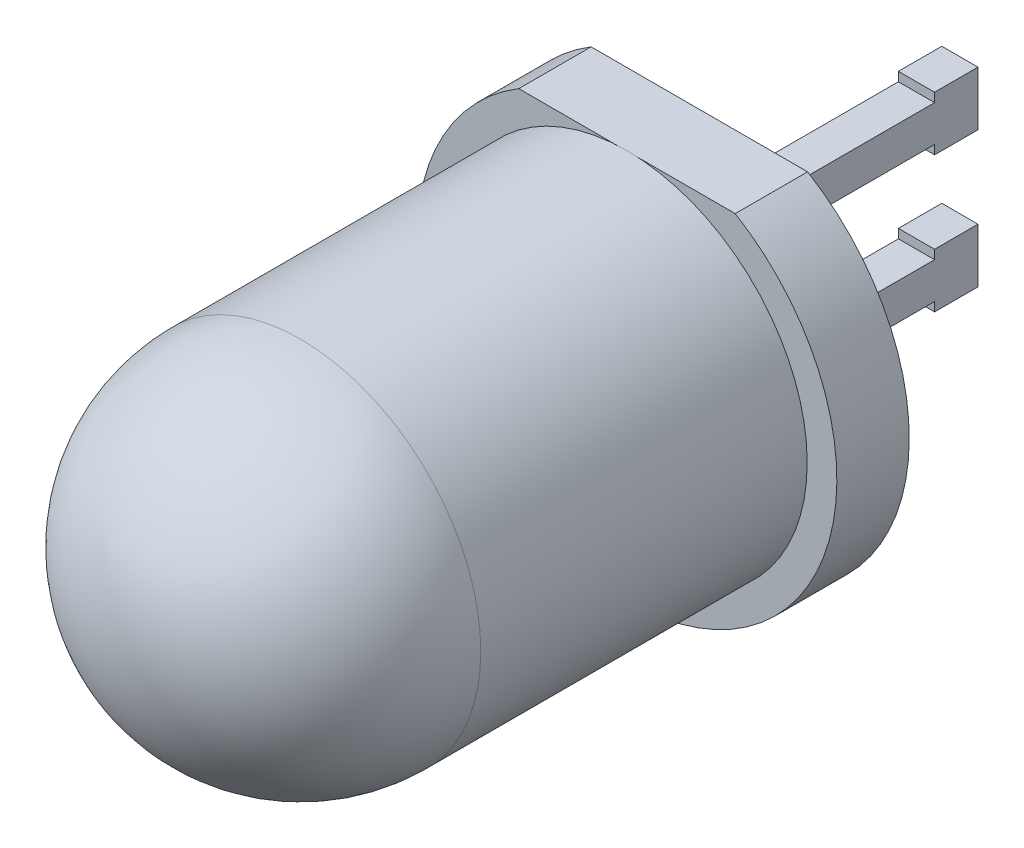
ISO-10303-21;
HEADER;
FILE_DESCRIPTION(('STEP AP214'),'2;1');
FILE_NAME('part.step','',(''),(''),'','','');
FILE_SCHEMA(('AUTOMOTIVE_DESIGN { 1 0 10303 214 1 1 1 1 }'));
ENDSEC;
DATA;
#1=APPLICATION_CONTEXT('core data for automotive mechanical design processes');
#2=APPLICATION_PROTOCOL_DEFINITION('international standard','automotive_design',2000,#1);
#3=PRODUCT_CONTEXT('',#1,'mechanical');
#4=PRODUCT('Part','Part','',(#3));
#5=PRODUCT_RELATED_PRODUCT_CATEGORY('part','',(#4));
#6=PRODUCT_DEFINITION_FORMATION('','',#4);
#7=PRODUCT_DEFINITION_CONTEXT('part definition',#1,'design');
#8=PRODUCT_DEFINITION('design','',#6,#7);
#9=PRODUCT_DEFINITION_SHAPE('','',#8);
#10=(LENGTH_UNIT() NAMED_UNIT(*) SI_UNIT(.MILLI.,.METRE.));
#11=(NAMED_UNIT(*) PLANE_ANGLE_UNIT() SI_UNIT($,.RADIAN.));
#12=(NAMED_UNIT(*) SI_UNIT($,.STERADIAN.) SOLID_ANGLE_UNIT());
#13=UNCERTAINTY_MEASURE_WITH_UNIT(LENGTH_MEASURE(1.E-05),#10,'distance_accuracy_value','');
#14=(GEOMETRIC_REPRESENTATION_CONTEXT(3) GLOBAL_UNCERTAINTY_ASSIGNED_CONTEXT((#13)) GLOBAL_UNIT_ASSIGNED_CONTEXT((#10,
#11,#12)) REPRESENTATION_CONTEXT('',''));
#15=CARTESIAN_POINT('',(0.,0.,0.));
#16=DIRECTION('',(0.,0.,1.));
#17=DIRECTION('',(1.,0.,0.));
#18=AXIS2_PLACEMENT_3D('',#15,#16,#17);
#19=CARTESIAN_POINT('',(0.25,-0.689703300157765,-29.));
#20=DIRECTION('',(0.,1.,0.));
#21=DIRECTION('',(-1.,0.,0.));
#22=AXIS2_PLACEMENT_3D('',#19,#20,#21);
#23=PLANE('',#22);
#24=DIRECTION('',(1.,0.,0.));
#25=VECTOR('',#24,1.);
#26=CARTESIAN_POINT('',(0.25,-0.689703300157765,-4.));
#27=LINE('',#26,#25);
#28=CARTESIAN_POINT('',(-0.249999999999999,-0.689703300157765,-4.));
#29=VERTEX_POINT('',#28);
#30=CARTESIAN_POINT('',(0.25,-0.689703300157765,-4.));
#31=VERTEX_POINT('',#30);
#32=EDGE_CURVE('E291',#29,#31,#27,.T.);
#33=ORIENTED_EDGE('',*,*,#32,.F.);
#34=DIRECTION('',(0.,0.,1.));
#35=VECTOR('',#34,1.);
#36=CARTESIAN_POINT('',(-0.25,-0.689703300157765,-29.));
#37=LINE('',#36,#35);
#38=CARTESIAN_POINT('',(-0.25,-0.689703300157765,-1.));
#39=VERTEX_POINT('',#38);
#40=EDGE_CURVE('E229',#29,#39,#37,.T.);
#41=ORIENTED_EDGE('',*,*,#40,.T.);
#42=DIRECTION('',(-1.,0.,0.));
#43=VECTOR('',#42,1.);
#44=CARTESIAN_POINT('',(0.25,-0.689703300157765,-1.));
#45=LINE('',#44,#43);
#46=CARTESIAN_POINT('',(0.25,-0.689703300157765,-1.));
#47=VERTEX_POINT('',#46);
#48=EDGE_CURVE('E217',#47,#39,#45,.T.);
#49=ORIENTED_EDGE('',*,*,#48,.F.);
#50=DIRECTION('',(0.,0.,1.));
#51=VECTOR('',#50,1.);
#52=CARTESIAN_POINT('',(0.25,-0.689703300157765,-29.));
#53=LINE('',#52,#51);
#54=EDGE_CURVE('E230',#31,#47,#53,.T.);
#55=ORIENTED_EDGE('',*,*,#54,.F.);
#56=EDGE_LOOP('',(#33,#41,#49,#55));
#57=FACE_BOUND('',#56,.T.);
#58=ADVANCED_FACE('F42',(#57),#23,.T.);
#59=CARTESIAN_POINT('',(0.25,-1.18970330015777,-29.));
#60=DIRECTION('',(0.,1.,0.));
#61=DIRECTION('',(-1.,0.,0.));
#62=AXIS2_PLACEMENT_3D('',#59,#60,#61);
#63=PLANE('',#62);
#64=DIRECTION('',(0.,0.,1.));
#65=VECTOR('',#64,1.);
#66=CARTESIAN_POINT('',(-0.25,-1.18970330015777,-29.));
#67=LINE('',#66,#65);
#68=CARTESIAN_POINT('',(-0.25,-1.18970330015777,-4.));
#69=VERTEX_POINT('',#68);
#70=CARTESIAN_POINT('',(-0.25,-1.18970330015777,-1.));
#71=VERTEX_POINT('',#70);
#72=EDGE_CURVE('E235',#69,#71,#67,.T.);
#73=ORIENTED_EDGE('',*,*,#72,.F.);
#74=DIRECTION('',(1.,0.,0.));
#75=VECTOR('',#74,1.);
#76=CARTESIAN_POINT('',(0.25,-1.18970330015777,-4.));
#77=LINE('',#76,#75);
#78=CARTESIAN_POINT('',(0.25,-1.18970330015777,-4.));
#79=VERTEX_POINT('',#78);
#80=EDGE_CURVE('E294',#69,#79,#77,.T.);
#81=ORIENTED_EDGE('',*,*,#80,.T.);
#82=DIRECTION('',(0.,0.,1.));
#83=VECTOR('',#82,1.);
#84=CARTESIAN_POINT('',(0.25,-1.18970330015777,-29.));
#85=LINE('',#84,#83);
#86=CARTESIAN_POINT('',(0.25,-1.18970330015777,-1.));
#87=VERTEX_POINT('',#86);
#88=EDGE_CURVE('E233',#79,#87,#85,.T.);
#89=ORIENTED_EDGE('',*,*,#88,.T.);
#90=DIRECTION('',(-1.,0.,0.));
#91=VECTOR('',#90,1.);
#92=CARTESIAN_POINT('',(0.25,-1.18970330015777,-1.));
#93=LINE('',#92,#91);
#94=EDGE_CURVE('E223',#87,#71,#93,.T.);
#95=ORIENTED_EDGE('',*,*,#94,.T.);
#96=EDGE_LOOP('',(#73,#81,#89,#95));
#97=FACE_BOUND('',#96,.T.);
#98=ADVANCED_FACE('F358',(#97),#63,.F.);
#99=CARTESIAN_POINT('',(0.249999999999998,0.689703300157765,-26.4));
#100=DIRECTION('',(0.,1.,0.));
#101=DIRECTION('',(-1.,0.,0.));
#102=AXIS2_PLACEMENT_3D('',#99,#100,#101);
#103=PLANE('',#102);
#104=DIRECTION('',(0.,0.,1.));
#105=VECTOR('',#104,1.);
#106=CARTESIAN_POINT('',(-0.249999999999998,0.689703300157765,-26.4));
#107=LINE('',#106,#105);
#108=CARTESIAN_POINT('',(-0.249999999999998,0.689703300157765,-4.));
#109=VERTEX_POINT('',#108);
#110=CARTESIAN_POINT('',(-0.249999999999998,0.689703300157765,-1.));
#111=VERTEX_POINT('',#110);
#112=EDGE_CURVE('E213',#109,#111,#107,.T.);
#113=ORIENTED_EDGE('',*,*,#112,.F.);
#114=DIRECTION('',(1.,0.,0.));
#115=VECTOR('',#114,1.);
#116=CARTESIAN_POINT('',(0.249999999999998,0.689703300157765,-4.));
#117=LINE('',#116,#115);
#118=CARTESIAN_POINT('',(0.25,0.689703300157765,-4.));
#119=VERTEX_POINT('',#118);
#120=EDGE_CURVE('E187',#109,#119,#117,.T.);
#121=ORIENTED_EDGE('',*,*,#120,.T.);
#122=DIRECTION('',(0.,0.,1.));
#123=VECTOR('',#122,1.);
#124=CARTESIAN_POINT('',(0.249999999999998,0.689703300157765,-26.4));
#125=LINE('',#124,#123);
#126=CARTESIAN_POINT('',(0.249999999999998,0.689703300157765,-1.));
#127=VERTEX_POINT('',#126);
#128=EDGE_CURVE('E215',#119,#127,#125,.T.);
#129=ORIENTED_EDGE('',*,*,#128,.T.);
#130=DIRECTION('',(-1.,0.,0.));
#131=VECTOR('',#130,1.);
#132=CARTESIAN_POINT('',(0.249999999999998,0.689703300157765,-1.));
#133=LINE('',#132,#131);
#134=EDGE_CURVE('E200',#127,#111,#133,.T.);
#135=ORIENTED_EDGE('',*,*,#134,.T.);
#136=EDGE_LOOP('',(#113,#121,#129,#135));
#137=FACE_BOUND('',#136,.T.);
#138=ADVANCED_FACE('F269',(#137),#103,.F.);
#139=CARTESIAN_POINT('',(0.250000000000002,1.18970330015777,-26.4));
#140=DIRECTION('',(0.,1.,0.));
#141=DIRECTION('',(-1.,0.,0.));
#142=AXIS2_PLACEMENT_3D('',#139,#140,#141);
#143=PLANE('',#142);
#144=DIRECTION('',(1.,0.,0.));
#145=VECTOR('',#144,1.);
#146=CARTESIAN_POINT('',(0.250000000000002,1.18970330015777,-4.));
#147=LINE('',#146,#145);
#148=CARTESIAN_POINT('',(-0.249999999999998,1.18970330015777,-4.));
#149=VERTEX_POINT('',#148);
#150=CARTESIAN_POINT('',(0.250000000000002,1.18970330015777,-4.));
#151=VERTEX_POINT('',#150);
#152=EDGE_CURVE('E50',#149,#151,#147,.T.);
#153=ORIENTED_EDGE('',*,*,#152,.F.);
#154=DIRECTION('',(0.,0.,1.));
#155=VECTOR('',#154,1.);
#156=CARTESIAN_POINT('',(-0.249999999999998,1.18970330015777,-26.4));
#157=LINE('',#156,#155);
#158=CARTESIAN_POINT('',(-0.249999999999998,1.18970330015777,-1.));
#159=VERTEX_POINT('',#158);
#160=EDGE_CURVE('E211',#149,#159,#157,.T.);
#161=ORIENTED_EDGE('',*,*,#160,.T.);
#162=DIRECTION('',(-1.,0.,0.));
#163=VECTOR('',#162,1.);
#164=CARTESIAN_POINT('',(0.250000000000002,1.18970330015777,-1.));
#165=LINE('',#164,#163);
#166=CARTESIAN_POINT('',(0.250000000000002,1.18970330015777,-1.));
#167=VERTEX_POINT('',#166);
#168=EDGE_CURVE('E206',#167,#159,#165,.T.);
#169=ORIENTED_EDGE('',*,*,#168,.F.);
#170=DIRECTION('',(0.,0.,1.));
#171=VECTOR('',#170,1.);
#172=CARTESIAN_POINT('',(0.250000000000002,1.18970330015777,-26.4));
#173=LINE('',#172,#171);
#174=EDGE_CURVE('E209',#151,#167,#173,.T.);
#175=ORIENTED_EDGE('',*,*,#174,.F.);
#176=EDGE_LOOP('',(#153,#161,#169,#175));
#177=FACE_BOUND('',#176,.T.);
#178=ADVANCED_FACE('F262',(#177),#143,.T.);
#179=CARTESIAN_POINT('',(0.,0.,-1.));
#180=DIRECTION('',(0.,0.,-1.));
#181=DIRECTION('',(-1.,0.,0.));
#182=AXIS2_PLACEMENT_3D('',#179,#180,#181);
#183=PLANE('',#182);
#184=DIRECTION('',(-1.,0.,0.));
#185=VECTOR('',#184,1.);
#186=CARTESIAN_POINT('',(-1.78380537400145,2.48458605664485,-1.));
#187=LINE('',#186,#185);
#188=CARTESIAN_POINT('',(1.49560426822271,2.48458605664485,-1.));
#189=VERTEX_POINT('',#188);
#190=CARTESIAN_POINT('',(-1.49560426822271,2.48458605664485,-1.));
#191=VERTEX_POINT('',#190);
#192=EDGE_CURVE('E232',#189,#191,#187,.T.);
#193=ORIENTED_EDGE('',*,*,#192,.F.);
#194=CARTESIAN_POINT('',(0.,0.,-1.));
#195=DIRECTION('',(0.,0.,-1.));
#196=DIRECTION('',(-1.,0.,0.));
#197=AXIS2_PLACEMENT_3D('',#194,#195,#196);
#198=CIRCLE('',#197,2.9);
#199=EDGE_CURVE('E246',#189,#191,#198,.T.);
#200=ORIENTED_EDGE('',*,*,#199,.T.);
#201=EDGE_LOOP('',(#193,#200));
#202=FACE_BOUND('',#201,.T.);
#203=ORIENTED_EDGE('',*,*,#48,.T.);
#204=DIRECTION('',(0.,-1.,0.));
#205=VECTOR('',#204,1.);
#206=CARTESIAN_POINT('',(-0.25,-0.689703300157765,-1.));
#207=LINE('',#206,#205);
#208=EDGE_CURVE('E220',#39,#71,#207,.T.);
#209=ORIENTED_EDGE('',*,*,#208,.T.);
#210=ORIENTED_EDGE('',*,*,#94,.F.);
#211=DIRECTION('',(0.,-1.,0.));
#212=VECTOR('',#211,1.);
#213=CARTESIAN_POINT('',(0.25,-0.689703300157765,-1.));
#214=LINE('',#213,#212);
#215=EDGE_CURVE('E226',#47,#87,#214,.T.);
#216=ORIENTED_EDGE('',*,*,#215,.F.);
#217=EDGE_LOOP('',(#203,#209,#210,#216));
#218=FACE_BOUND('',#217,.T.);
#219=ORIENTED_EDGE('',*,*,#134,.F.);
#220=DIRECTION('',(0.,-1.,0.));
#221=VECTOR('',#220,1.);
#222=CARTESIAN_POINT('',(0.250000000000002,1.18970330015777,-1.));
#223=LINE('',#222,#221);
#224=EDGE_CURVE('E191',#167,#127,#223,.T.);
#225=ORIENTED_EDGE('',*,*,#224,.F.);
#226=ORIENTED_EDGE('',*,*,#168,.T.);
#227=DIRECTION('',(0.,-1.,0.));
#228=VECTOR('',#227,1.);
#229=CARTESIAN_POINT('',(-0.249999999999998,1.18970330015777,-1.));
#230=LINE('',#229,#228);
#231=EDGE_CURVE('E203',#159,#111,#230,.T.);
#232=ORIENTED_EDGE('',*,*,#231,.T.);
#233=EDGE_LOOP('',(#219,#225,#226,#232));
#234=FACE_BOUND('',#233,.T.);
#235=ADVANCED_FACE('F266',(#202,#218,#234),#183,.T.);
#236=CARTESIAN_POINT('',(0.,0.,-1.));
#237=DIRECTION('',(0.,0.,1.));
#238=DIRECTION('',(1.,0.,0.));
#239=AXIS2_PLACEMENT_3D('',#236,#237,#238);
#240=CYLINDRICAL_SURFACE('',#239,2.9);
#241=ORIENTED_EDGE('',*,*,#199,.F.);
#242=DIRECTION('',(0.,0.,1.));
#243=VECTOR('',#242,1.);
#244=CARTESIAN_POINT('',(1.49560426822271,2.48458605664485,-1.));
#245=LINE('',#244,#243);
#246=CARTESIAN_POINT('',(1.49560426822271,2.48458605664485,0.));
#247=VERTEX_POINT('',#246);
#248=EDGE_CURVE('E242',#189,#247,#245,.T.);
#249=ORIENTED_EDGE('',*,*,#248,.T.);
#250=CARTESIAN_POINT('',(0.,0.,0.));
#251=DIRECTION('',(0.,0.,-1.));
#252=DIRECTION('',(-1.,0.,0.));
#253=AXIS2_PLACEMENT_3D('',#250,#251,#252);
#254=CIRCLE('',#253,2.9);
#255=CARTESIAN_POINT('',(-1.49560426822271,2.48458605664485,0.));
#256=VERTEX_POINT('',#255);
#257=EDGE_CURVE('E245',#247,#256,#254,.T.);
#258=ORIENTED_EDGE('',*,*,#257,.T.);
#259=DIRECTION('',(0.,0.,1.));
#260=VECTOR('',#259,1.);
#261=CARTESIAN_POINT('',(-1.49560426822271,2.48458605664485,-1.));
#262=LINE('',#261,#260);
#263=EDGE_CURVE('E239',#256,#191,#262,.F.);
#264=ORIENTED_EDGE('',*,*,#263,.T.);
#265=EDGE_LOOP('',(#241,#249,#258,#264));
#266=FACE_BOUND('',#265,.T.);
#267=ADVANCED_FACE('F44',(#266),#240,.T.);
#268=CARTESIAN_POINT('',(0.,0.,0.));
#269=DIRECTION('',(0.,0.,-1.));
#270=DIRECTION('',(-1.,0.,0.));
#271=AXIS2_PLACEMENT_3D('',#268,#269,#270);
#272=PLANE('',#271);
#273=ORIENTED_EDGE('',*,*,#257,.F.);
#274=DIRECTION('',(-1.,0.,0.));
#275=VECTOR('',#274,1.);
#276=CARTESIAN_POINT('',(0.,2.48458605664485,0.));
#277=LINE('',#276,#275);
#278=EDGE_CURVE('E249',#247,#256,#277,.T.);
#279=ORIENTED_EDGE('',*,*,#278,.T.);
#280=EDGE_LOOP('',(#273,#279));
#281=FACE_BOUND('',#280,.T.);
#282=ADVANCED_FACE('F375',(#281),#272,.F.);
#283=CARTESIAN_POINT('',(-1.78380537400145,2.48458605664485,0.));
#284=DIRECTION('',(0.,-1.,0.));
#285=DIRECTION('',(0.,0.,-1.));
#286=AXIS2_PLACEMENT_3D('',#283,#284,#285);
#287=PLANE('',#286);
#288=ORIENTED_EDGE('',*,*,#192,.T.);
#289=ORIENTED_EDGE('',*,*,#263,.F.);
#290=ORIENTED_EDGE('',*,*,#278,.F.);
#291=ORIENTED_EDGE('',*,*,#248,.F.);
#292=EDGE_LOOP('',(#288,#289,#290,#291));
#293=FACE_BOUND('',#292,.T.);
#294=ADVANCED_FACE('F372',(#293),#287,.F.);
#295=CARTESIAN_POINT('',(0.25,-0.689703300157765,-29.));
#296=DIRECTION('',(-1.,0.,0.));
#297=DIRECTION('',(0.,-1.,0.));
#298=AXIS2_PLACEMENT_3D('',#295,#296,#297);
#299=PLANE('',#298);
#300=DIRECTION('',(0.,0.,-1.));
#301=VECTOR('',#300,1.);
#302=CARTESIAN_POINT('',(0.25,-1.31470330015776,-4.));
#303=LINE('',#302,#301);
#304=CARTESIAN_POINT('',(0.25,-1.31470330015776,-4.));
#305=VERTEX_POINT('',#304);
#306=CARTESIAN_POINT('',(0.249999999999982,-1.31470330015777,-4.6));
#307=VERTEX_POINT('',#306);
#308=EDGE_CURVE('E307',#305,#307,#303,.T.);
#309=ORIENTED_EDGE('',*,*,#308,.T.);
#310=DIRECTION('',(0.,-1.,0.));
#311=VECTOR('',#310,1.);
#312=CARTESIAN_POINT('',(0.249999999999969,-2.9,-4.6));
#313=LINE('',#312,#311);
#314=CARTESIAN_POINT('',(0.249999999999988,-0.564703300157766,-4.6));
#315=VERTEX_POINT('',#314);
#316=EDGE_CURVE('E181',#315,#307,#313,.T.);
#317=ORIENTED_EDGE('',*,*,#316,.F.);
#318=DIRECTION('',(0.,0.,1.));
#319=VECTOR('',#318,1.);
#320=CARTESIAN_POINT('',(0.25,-0.564703300157765,-4.));
#321=LINE('',#320,#319);
#322=CARTESIAN_POINT('',(0.25,-0.564703300157765,-4.));
#323=VERTEX_POINT('',#322);
#324=EDGE_CURVE('E297',#315,#323,#321,.T.);
#325=ORIENTED_EDGE('',*,*,#324,.T.);
#326=DIRECTION('',(0.,-1.,0.));
#327=VECTOR('',#326,1.);
#328=CARTESIAN_POINT('',(0.25,-0.564703300157765,-4.));
#329=LINE('',#328,#327);
#330=EDGE_CURVE('E299',#323,#31,#329,.T.);
#331=ORIENTED_EDGE('',*,*,#330,.T.);
#332=ORIENTED_EDGE('',*,*,#54,.T.);
#333=ORIENTED_EDGE('',*,*,#215,.T.);
#334=ORIENTED_EDGE('',*,*,#88,.F.);
#335=EDGE_CURVE('E316',#79,#305,#329,.T.);
#336=ORIENTED_EDGE('',*,*,#335,.T.);
#337=EDGE_LOOP('',(#309,#317,#325,#331,#332,#333,#334,#336));
#338=FACE_BOUND('',#337,.T.);
#339=ADVANCED_FACE('F333',(#338),#299,.F.);
#340=CARTESIAN_POINT('',(-0.25,-0.689703300157765,-29.));
#341=DIRECTION('',(-1.,0.,0.));
#342=DIRECTION('',(0.,-1.,0.));
#343=AXIS2_PLACEMENT_3D('',#340,#341,#342);
#344=PLANE('',#343);
#345=DIRECTION('',(0.,1.,0.));
#346=VECTOR('',#345,1.);
#347=CARTESIAN_POINT('',(-0.25,-0.689703300157765,-4.6));
#348=LINE('',#347,#346);
#349=CARTESIAN_POINT('',(-0.25,-1.31470330015777,-4.6));
#350=VERTEX_POINT('',#349);
#351=CARTESIAN_POINT('',(-0.249999999999999,-0.564703300157765,-4.6));
#352=VERTEX_POINT('',#351);
#353=EDGE_CURVE('E64',#350,#352,#348,.T.);
#354=ORIENTED_EDGE('',*,*,#353,.F.);
#355=DIRECTION('',(0.,0.,1.));
#356=VECTOR('',#355,1.);
#357=CARTESIAN_POINT('',(-0.249999999999999,-1.31470330015776,-4.));
#358=LINE('',#357,#356);
#359=CARTESIAN_POINT('',(-0.249999999999999,-1.31470330015776,-4.));
#360=VERTEX_POINT('',#359);
#361=EDGE_CURVE('E304',#350,#360,#358,.T.);
#362=ORIENTED_EDGE('',*,*,#361,.T.);
#363=DIRECTION('',(0.,1.,0.));
#364=VECTOR('',#363,1.);
#365=CARTESIAN_POINT('',(-0.249999999999999,-0.564703300157765,-4.));
#366=LINE('',#365,#364);
#367=EDGE_CURVE('E312',#360,#69,#366,.T.);
#368=ORIENTED_EDGE('',*,*,#367,.T.);
#369=ORIENTED_EDGE('',*,*,#72,.T.);
#370=ORIENTED_EDGE('',*,*,#208,.F.);
#371=ORIENTED_EDGE('',*,*,#40,.F.);
#372=CARTESIAN_POINT('',(-0.249999999999999,-0.564703300157765,-4.));
#373=VERTEX_POINT('',#372);
#374=EDGE_CURVE('E172',#29,#373,#366,.T.);
#375=ORIENTED_EDGE('',*,*,#374,.T.);
#376=DIRECTION('',(0.,0.,-1.));
#377=VECTOR('',#376,1.);
#378=CARTESIAN_POINT('',(-0.249999999999999,-0.564703300157765,-4.));
#379=LINE('',#378,#377);
#380=EDGE_CURVE('E309',#373,#352,#379,.T.);
#381=ORIENTED_EDGE('',*,*,#380,.T.);
#382=EDGE_LOOP('',(#354,#362,#368,#369,#370,#371,#375,#381));
#383=FACE_BOUND('',#382,.T.);
#384=ADVANCED_FACE('F340',(#383),#344,.T.);
#385=CARTESIAN_POINT('',(0.250000000000002,1.18970330015777,-26.4));
#386=DIRECTION('',(-1.,0.,0.));
#387=DIRECTION('',(0.,-1.,0.));
#388=AXIS2_PLACEMENT_3D('',#385,#386,#387);
#389=PLANE('',#388);
#390=DIRECTION('',(0.,0.,-1.));
#391=VECTOR('',#390,1.);
#392=CARTESIAN_POINT('',(0.25,0.564703300157765,-4.));
#393=LINE('',#392,#391);
#394=CARTESIAN_POINT('',(0.25,0.564703300157765,-4.));
#395=VERTEX_POINT('',#394);
#396=CARTESIAN_POINT('',(0.25,0.564703300157765,-4.6));
#397=VERTEX_POINT('',#396);
#398=EDGE_CURVE('E180',#395,#397,#393,.T.);
#399=ORIENTED_EDGE('',*,*,#398,.T.);
#400=CARTESIAN_POINT('',(0.250000000000003,1.31470330015776,-4.6));
#401=VERTEX_POINT('',#400);
#402=EDGE_CURVE('E57',#401,#397,#313,.T.);
#403=ORIENTED_EDGE('',*,*,#402,.F.);
#404=DIRECTION('',(0.,0.,1.));
#405=VECTOR('',#404,1.);
#406=CARTESIAN_POINT('',(0.25,1.31470330015777,-4.));
#407=LINE('',#406,#405);
#408=CARTESIAN_POINT('',(0.25,1.31470330015777,-4.));
#409=VERTEX_POINT('',#408);
#410=EDGE_CURVE('E177',#401,#409,#407,.T.);
#411=ORIENTED_EDGE('',*,*,#410,.T.);
#412=DIRECTION('',(0.,-1.,0.));
#413=VECTOR('',#412,1.);
#414=CARTESIAN_POINT('',(0.25,1.31470330015776,-4.));
#415=LINE('',#414,#413);
#416=EDGE_CURVE('E188',#409,#151,#415,.T.);
#417=ORIENTED_EDGE('',*,*,#416,.T.);
#418=ORIENTED_EDGE('',*,*,#174,.T.);
#419=ORIENTED_EDGE('',*,*,#224,.T.);
#420=ORIENTED_EDGE('',*,*,#128,.F.);
#421=EDGE_CURVE('E193',#119,#395,#415,.T.);
#422=ORIENTED_EDGE('',*,*,#421,.T.);
#423=EDGE_LOOP('',(#399,#403,#411,#417,#418,#419,#420,#422));
#424=FACE_BOUND('',#423,.T.);
#425=ADVANCED_FACE('F176',(#424),#389,.F.);
#426=CARTESIAN_POINT('',(-0.249999999999998,1.18970330015777,-26.4));
#427=DIRECTION('',(-1.,0.,0.));
#428=DIRECTION('',(0.,-1.,0.));
#429=AXIS2_PLACEMENT_3D('',#426,#427,#428);
#430=PLANE('',#429);
#431=DIRECTION('',(0.,1.,0.));
#432=VECTOR('',#431,1.);
#433=CARTESIAN_POINT('',(-0.249999999999998,1.18970330015777,-4.6));
#434=LINE('',#433,#432);
#435=CARTESIAN_POINT('',(-0.249999999999999,0.564703300157765,-4.6));
#436=VERTEX_POINT('',#435);
#437=CARTESIAN_POINT('',(-0.249999999999998,1.31470330015777,-4.6));
#438=VERTEX_POINT('',#437);
#439=EDGE_CURVE('E167',#436,#438,#434,.T.);
#440=ORIENTED_EDGE('',*,*,#439,.F.);
#441=DIRECTION('',(0.,0.,1.));
#442=VECTOR('',#441,1.);
#443=CARTESIAN_POINT('',(-0.249999999999998,0.564703300157765,-4.));
#444=LINE('',#443,#442);
#445=CARTESIAN_POINT('',(-0.249999999999998,0.564703300157765,-4.));
#446=VERTEX_POINT('',#445);
#447=EDGE_CURVE('E285',#436,#446,#444,.T.);
#448=ORIENTED_EDGE('',*,*,#447,.T.);
#449=DIRECTION('',(0.,1.,0.));
#450=VECTOR('',#449,1.);
#451=CARTESIAN_POINT('',(-0.249999999999998,1.31470330015777,-4.));
#452=LINE('',#451,#450);
#453=EDGE_CURVE('E284',#446,#109,#452,.T.);
#454=ORIENTED_EDGE('',*,*,#453,.T.);
#455=ORIENTED_EDGE('',*,*,#112,.T.);
#456=ORIENTED_EDGE('',*,*,#231,.F.);
#457=ORIENTED_EDGE('',*,*,#160,.F.);
#458=CARTESIAN_POINT('',(-0.249999999999998,1.31470330015777,-4.));
#459=VERTEX_POINT('',#458);
#460=EDGE_CURVE('E258',#149,#459,#452,.T.);
#461=ORIENTED_EDGE('',*,*,#460,.T.);
#462=DIRECTION('',(0.,0.,-1.));
#463=VECTOR('',#462,1.);
#464=CARTESIAN_POINT('',(-0.249999999999998,1.31470330015777,-4.));
#465=LINE('',#464,#463);
#466=EDGE_CURVE('E288',#459,#438,#465,.T.);
#467=ORIENTED_EDGE('',*,*,#466,.T.);
#468=EDGE_LOOP('',(#440,#448,#454,#455,#456,#457,#461,#467));
#469=FACE_BOUND('',#468,.T.);
#470=ADVANCED_FACE('F458',(#469),#430,.T.);
#471=CARTESIAN_POINT('',(1.92705098312484,1.31470330015777,-4.));
#472=DIRECTION('',(0.,1.,0.));
#473=DIRECTION('',(0.,0.,1.));
#474=AXIS2_PLACEMENT_3D('',#471,#472,#473);
#475=PLANE('',#474);
#476=DIRECTION('',(1.,0.,0.));
#477=VECTOR('',#476,1.);
#478=CARTESIAN_POINT('',(1.92705098312484,1.31470330015777,-4.6));
#479=LINE('',#478,#477);
#480=EDGE_CURVE('E164',#438,#401,#479,.T.);
#481=ORIENTED_EDGE('',*,*,#480,.F.);
#482=ORIENTED_EDGE('',*,*,#466,.F.);
#483=DIRECTION('',(-1.,0.,0.));
#484=VECTOR('',#483,1.);
#485=CARTESIAN_POINT('',(1.92705098312484,1.31470330015777,-4.));
#486=LINE('',#485,#484);
#487=EDGE_CURVE('E186',#409,#459,#486,.T.);
#488=ORIENTED_EDGE('',*,*,#487,.F.);
#489=ORIENTED_EDGE('',*,*,#410,.F.);
#490=EDGE_LOOP('',(#481,#482,#488,#489));
#491=FACE_BOUND('',#490,.T.);
#492=ADVANCED_FACE('F184',(#491),#475,.T.);
#493=CARTESIAN_POINT('',(1.92705098312484,1.31470330015777,-4.));
#494=DIRECTION('',(0.,0.,1.));
#495=DIRECTION('',(1.,0.,0.));
#496=AXIS2_PLACEMENT_3D('',#493,#494,#495);
#497=PLANE('',#496);
#498=ORIENTED_EDGE('',*,*,#460,.F.);
#499=ORIENTED_EDGE('',*,*,#152,.T.);
#500=ORIENTED_EDGE('',*,*,#416,.F.);
#501=ORIENTED_EDGE('',*,*,#487,.T.);
#502=EDGE_LOOP('',(#498,#499,#500,#501));
#503=FACE_BOUND('',#502,.T.);
#504=ADVANCED_FACE('F257',(#503),#497,.T.);
#505=ORIENTED_EDGE('',*,*,#120,.F.);
#506=ORIENTED_EDGE('',*,*,#453,.F.);
#507=DIRECTION('',(-1.,0.,0.));
#508=VECTOR('',#507,1.);
#509=CARTESIAN_POINT('',(1.92705098312484,0.564703300157765,-4.));
#510=LINE('',#509,#508);
#511=EDGE_CURVE('E278',#395,#446,#510,.T.);
#512=ORIENTED_EDGE('',*,*,#511,.F.);
#513=ORIENTED_EDGE('',*,*,#421,.F.);
#514=EDGE_LOOP('',(#505,#506,#512,#513));
#515=FACE_BOUND('',#514,.T.);
#516=ADVANCED_FACE('F282',(#515),#497,.T.);
#517=CARTESIAN_POINT('',(1.92705098312484,0.564703300157765,-4.));
#518=DIRECTION('',(0.,-1.,0.));
#519=DIRECTION('',(0.,0.,-1.));
#520=AXIS2_PLACEMENT_3D('',#517,#518,#519);
#521=PLANE('',#520);
#522=DIRECTION('',(-1.,0.,0.));
#523=VECTOR('',#522,1.);
#524=CARTESIAN_POINT('',(1.92705098312484,0.564703300157765,-4.6));
#525=LINE('',#524,#523);
#526=EDGE_CURVE('E280',#397,#436,#525,.T.);
#527=ORIENTED_EDGE('',*,*,#526,.F.);
#528=ORIENTED_EDGE('',*,*,#398,.F.);
#529=ORIENTED_EDGE('',*,*,#511,.T.);
#530=ORIENTED_EDGE('',*,*,#447,.F.);
#531=EDGE_LOOP('',(#527,#528,#529,#530));
#532=FACE_BOUND('',#531,.T.);
#533=ADVANCED_FACE('F276',(#532),#521,.T.);
#534=CARTESIAN_POINT('',(1.92705098312484,-1.31470330015777,-4.));
#535=DIRECTION('',(0.,-1.,0.));
#536=DIRECTION('',(0.,0.,-1.));
#537=AXIS2_PLACEMENT_3D('',#534,#535,#536);
#538=PLANE('',#537);
#539=DIRECTION('',(-1.,0.,0.));
#540=VECTOR('',#539,1.);
#541=CARTESIAN_POINT('',(1.92705098312484,-1.31470330015777,-4.6));
#542=LINE('',#541,#540);
#543=EDGE_CURVE('E321',#307,#350,#542,.T.);
#544=ORIENTED_EDGE('',*,*,#543,.F.);
#545=ORIENTED_EDGE('',*,*,#308,.F.);
#546=DIRECTION('',(-1.,0.,0.));
#547=VECTOR('',#546,1.);
#548=CARTESIAN_POINT('',(1.92705098312484,-1.31470330015777,-4.));
#549=LINE('',#548,#547);
#550=EDGE_CURVE('E303',#305,#360,#549,.T.);
#551=ORIENTED_EDGE('',*,*,#550,.T.);
#552=ORIENTED_EDGE('',*,*,#361,.F.);
#553=EDGE_LOOP('',(#544,#545,#551,#552));
#554=FACE_BOUND('',#553,.T.);
#555=ADVANCED_FACE('F331',(#554),#538,.T.);
#556=CARTESIAN_POINT('',(1.92705098312484,-0.564703300157765,-4.));
#557=DIRECTION('',(0.,0.,1.));
#558=DIRECTION('',(1.,0.,0.));
#559=AXIS2_PLACEMENT_3D('',#556,#557,#558);
#560=PLANE('',#559);
#561=ORIENTED_EDGE('',*,*,#80,.F.);
#562=ORIENTED_EDGE('',*,*,#367,.F.);
#563=ORIENTED_EDGE('',*,*,#550,.F.);
#564=ORIENTED_EDGE('',*,*,#335,.F.);
#565=EDGE_LOOP('',(#561,#562,#563,#564));
#566=FACE_BOUND('',#565,.T.);
#567=ADVANCED_FACE('F337',(#566),#560,.T.);
#568=ORIENTED_EDGE('',*,*,#374,.F.);
#569=ORIENTED_EDGE('',*,*,#32,.T.);
#570=ORIENTED_EDGE('',*,*,#330,.F.);
#571=DIRECTION('',(-1.,0.,0.));
#572=VECTOR('',#571,1.);
#573=CARTESIAN_POINT('',(1.92705098312484,-0.564703300157765,-4.));
#574=LINE('',#573,#572);
#575=EDGE_CURVE('E300',#323,#373,#574,.T.);
#576=ORIENTED_EDGE('',*,*,#575,.T.);
#577=EDGE_LOOP('',(#568,#569,#570,#576));
#578=FACE_BOUND('',#577,.T.);
#579=ADVANCED_FACE('F349',(#578),#560,.T.);
#580=CARTESIAN_POINT('',(1.92705098312484,-0.564703300157765,-4.));
#581=DIRECTION('',(0.,1.,0.));
#582=DIRECTION('',(0.,0.,1.));
#583=AXIS2_PLACEMENT_3D('',#580,#581,#582);
#584=PLANE('',#583);
#585=DIRECTION('',(1.,0.,0.));
#586=VECTOR('',#585,1.);
#587=CARTESIAN_POINT('',(1.92705098312484,-0.564703300157765,-4.6));
#588=LINE('',#587,#586);
#589=EDGE_CURVE('E12',#352,#315,#588,.T.);
#590=ORIENTED_EDGE('',*,*,#589,.F.);
#591=ORIENTED_EDGE('',*,*,#380,.F.);
#592=ORIENTED_EDGE('',*,*,#575,.F.);
#593=ORIENTED_EDGE('',*,*,#324,.F.);
#594=EDGE_LOOP('',(#590,#591,#592,#593));
#595=FACE_BOUND('',#594,.T.);
#596=ADVANCED_FACE('F346',(#595),#584,.T.);
#597=CARTESIAN_POINT('',(-9.75000000000003,-2.89999999999992,-4.6));
#598=DIRECTION('',(0.,0.,1.));
#599=DIRECTION('',(1.,0.,0.));
#600=AXIS2_PLACEMENT_3D('',#597,#598,#599);
#601=PLANE('',#600);
#602=ORIENTED_EDGE('',*,*,#543,.T.);
#603=ORIENTED_EDGE('',*,*,#353,.T.);
#604=ORIENTED_EDGE('',*,*,#589,.T.);
#605=ORIENTED_EDGE('',*,*,#316,.T.);
#606=EDGE_LOOP('',(#602,#603,#604,#605));
#607=FACE_BOUND('',#606,.T.);
#608=ADVANCED_FACE('F325',(#607),#601,.F.);
#609=ORIENTED_EDGE('',*,*,#480,.T.);
#610=ORIENTED_EDGE('',*,*,#402,.T.);
#611=ORIENTED_EDGE('',*,*,#526,.T.);
#612=ORIENTED_EDGE('',*,*,#439,.T.);
#613=EDGE_LOOP('',(#609,#610,#611,#612));
#614=FACE_BOUND('',#613,.T.);
#615=ADVANCED_FACE('F165',(#614),#601,.F.);
#616=CLOSED_SHELL('',(#58,#98,#138,#178,#235,#267,#282,#294,#339,#384,#425,#470,#492,#504,#516,
#533,#555,#567,#579,#596,#608,#615));
#617=MANIFOLD_SOLID_BREP('B2',#616);
#618=CARTESIAN_POINT('',(0.,0.,7.));
#619=DIRECTION('',(0.,0.,-1.));
#620=DIRECTION('',(-1.,0.,0.));
#621=AXIS2_PLACEMENT_3D('',#618,#619,#620);
#622=CYLINDRICAL_SURFACE('',#621,2.49);
#623=CARTESIAN_POINT('',(0.,0.,4.51));
#624=DIRECTION('',(0.,0.,-1.));
#625=DIRECTION('',(-1.,0.,0.));
#626=AXIS2_PLACEMENT_3D('',#623,#624,#625);
#627=CIRCLE('',#626,2.49);
#628=CARTESIAN_POINT('',(-2.49,0.,4.51));
#629=VERTEX_POINT('',#628);
#630=EDGE_CURVE('E41',#629,#629,#627,.T.);
#631=ORIENTED_EDGE('',*,*,#630,.T.);
#632=EDGE_LOOP('',(#631));
#633=FACE_BOUND('',#632,.T.);
#634=CARTESIAN_POINT('',(0.,0.,0.));
#635=DIRECTION('',(0.,0.,1.));
#636=DIRECTION('',(1.,0.,0.));
#637=AXIS2_PLACEMENT_3D('',#634,#635,#636);
#638=CIRCLE('',#637,2.49);
#639=CARTESIAN_POINT('',(2.49,0.,0.));
#640=VERTEX_POINT('',#639);
#641=EDGE_CURVE('E570',#640,#640,#638,.T.);
#642=ORIENTED_EDGE('',*,*,#641,.T.);
#643=EDGE_LOOP('',(#642));
#644=FACE_BOUND('',#643,.T.);
#645=ADVANCED_FACE('F563',(#633,#644),#622,.T.);
#646=CARTESIAN_POINT('',(0.,0.,0.));
#647=DIRECTION('',(0.,0.,1.));
#648=DIRECTION('',(1.,0.,0.));
#649=AXIS2_PLACEMENT_3D('',#646,#647,#648);
#650=PLANE('',#649);
#651=ORIENTED_EDGE('',*,*,#641,.F.);
#652=EDGE_LOOP('',(#651));
#653=FACE_BOUND('',#652,.T.);
#654=ADVANCED_FACE('F577',(#653),#650,.F.);
#655=CARTESIAN_POINT('',(0.,0.,4.51));
#656=DIRECTION('',(0.,0.,1.));
#657=DIRECTION('',(1.,0.,0.));
#658=AXIS2_PLACEMENT_3D('',#655,#656,#657);
#659=SPHERICAL_SURFACE('',#658,2.49);
#660=ORIENTED_EDGE('',*,*,#630,.F.);
#661=EDGE_LOOP('',(#660));
#662=FACE_BOUND('',#661,.T.);
#663=ADVANCED_FACE('F565',(#662),#659,.T.);
#664=CLOSED_SHELL('',(#645,#654,#663));
#665=MANIFOLD_SOLID_BREP('B6',#664);
#666=ADVANCED_BREP_SHAPE_REPRESENTATION('',(#18,#617,#665),#14);
#667=SHAPE_DEFINITION_REPRESENTATION(#9,#666);
ENDSEC;
END-ISO-10303-21;
